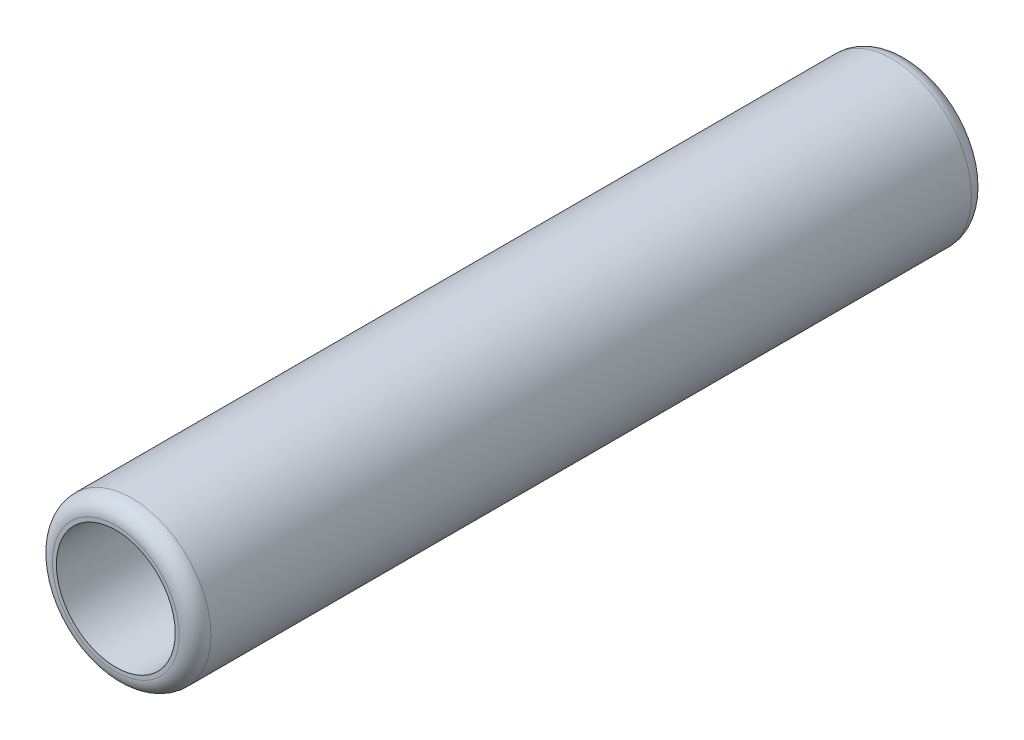
ISO-10303-21;
HEADER;
FILE_DESCRIPTION(('STEP AP214'),'2;1');
FILE_NAME('part.step','',(''),(''),'','','');
FILE_SCHEMA(('AUTOMOTIVE_DESIGN { 1 0 10303 214 1 1 1 1 }'));
ENDSEC;
DATA;
#1=APPLICATION_CONTEXT('core data for automotive mechanical design processes');
#2=APPLICATION_PROTOCOL_DEFINITION('international standard','automotive_design',2000,#1);
#3=PRODUCT_CONTEXT('',#1,'mechanical');
#4=PRODUCT('Part','Part','',(#3));
#5=PRODUCT_RELATED_PRODUCT_CATEGORY('part','',(#4));
#6=PRODUCT_DEFINITION_FORMATION('','',#4);
#7=PRODUCT_DEFINITION_CONTEXT('part definition',#1,'design');
#8=PRODUCT_DEFINITION('design','',#6,#7);
#9=PRODUCT_DEFINITION_SHAPE('','',#8);
#10=(LENGTH_UNIT() NAMED_UNIT(*) SI_UNIT(.MILLI.,.METRE.));
#11=(NAMED_UNIT(*) PLANE_ANGLE_UNIT() SI_UNIT($,.RADIAN.));
#12=(NAMED_UNIT(*) SI_UNIT($,.STERADIAN.) SOLID_ANGLE_UNIT());
#13=UNCERTAINTY_MEASURE_WITH_UNIT(LENGTH_MEASURE(1.E-05),#10,'distance_accuracy_value','');
#14=(GEOMETRIC_REPRESENTATION_CONTEXT(3) GLOBAL_UNCERTAINTY_ASSIGNED_CONTEXT((#13)) GLOBAL_UNIT_ASSIGNED_CONTEXT((#10,
#11,#12)) REPRESENTATION_CONTEXT('',''));
#15=CARTESIAN_POINT('',(0.,0.,0.));
#16=DIRECTION('',(0.,0.,1.));
#17=DIRECTION('',(1.,0.,0.));
#18=AXIS2_PLACEMENT_3D('',#15,#16,#17);
#19=CARTESIAN_POINT('',(0.,0.,100.));
#20=DIRECTION('',(0.,0.,1.));
#21=DIRECTION('',(1.,0.,0.));
#22=AXIS2_PLACEMENT_3D('',#19,#20,#21);
#23=PLANE('',#22);
#24=CARTESIAN_POINT('',(0.,0.,100.));
#25=DIRECTION('',(0.,0.,1.));
#26=DIRECTION('',(1.,0.,0.));
#27=AXIS2_PLACEMENT_3D('',#24,#25,#26);
#28=CIRCLE('',#27,8.);
#29=CARTESIAN_POINT('',(8.,0.,100.));
#30=VERTEX_POINT('',#29);
#31=EDGE_CURVE('E10',#30,#30,#28,.T.);
#32=ORIENTED_EDGE('',*,*,#31,.T.);
#33=EDGE_LOOP('',(#32));
#34=FACE_BOUND('',#33,.T.);
#35=CARTESIAN_POINT('',(0.,0.,100.));
#36=DIRECTION('',(0.,0.,1.));
#37=DIRECTION('',(1.,0.,0.));
#38=AXIS2_PLACEMENT_3D('',#35,#36,#37);
#39=CIRCLE('',#38,7.5);
#40=CARTESIAN_POINT('',(7.5,0.,100.));
#41=VERTEX_POINT('',#40);
#42=EDGE_CURVE('E63',#41,#41,#39,.T.);
#43=ORIENTED_EDGE('',*,*,#42,.F.);
#44=EDGE_LOOP('',(#43));
#45=FACE_BOUND('',#44,.T.);
#46=ADVANCED_FACE('F39',(#34,#45),#23,.T.);
#47=CARTESIAN_POINT('',(0.,0.,0.));
#48=DIRECTION('',(0.,0.,1.));
#49=DIRECTION('',(1.,0.,0.));
#50=AXIS2_PLACEMENT_3D('',#47,#48,#49);
#51=PLANE('',#50);
#52=CARTESIAN_POINT('',(0.,0.,0.));
#53=DIRECTION('',(0.,0.,1.));
#54=DIRECTION('',(1.,0.,0.));
#55=AXIS2_PLACEMENT_3D('',#52,#53,#54);
#56=CIRCLE('',#55,8.);
#57=CARTESIAN_POINT('',(8.,0.,0.));
#58=VERTEX_POINT('',#57);
#59=EDGE_CURVE('E47',#58,#58,#56,.F.);
#60=ORIENTED_EDGE('',*,*,#59,.T.);
#61=EDGE_LOOP('',(#60));
#62=FACE_BOUND('',#61,.T.);
#63=CARTESIAN_POINT('',(0.,0.,0.));
#64=DIRECTION('',(0.,0.,1.));
#65=DIRECTION('',(1.,0.,0.));
#66=AXIS2_PLACEMENT_3D('',#63,#64,#65);
#67=CIRCLE('',#66,7.5);
#68=CARTESIAN_POINT('',(7.5,0.,0.));
#69=VERTEX_POINT('',#68);
#70=EDGE_CURVE('E64',#69,#69,#67,.T.);
#71=ORIENTED_EDGE('',*,*,#70,.T.);
#72=EDGE_LOOP('',(#71));
#73=FACE_BOUND('',#72,.T.);
#74=ADVANCED_FACE('F76',(#62,#73),#51,.F.);
#75=CARTESIAN_POINT('',(0.,0.,100.));
#76=DIRECTION('',(0.,0.,-1.));
#77=DIRECTION('',(-1.,0.,0.));
#78=AXIS2_PLACEMENT_3D('',#75,#76,#77);
#79=CYLINDRICAL_SURFACE('',#78,10.);
#80=CARTESIAN_POINT('',(0.,0.,2.));
#81=DIRECTION('',(0.,0.,1.));
#82=DIRECTION('',(1.,0.,0.));
#83=AXIS2_PLACEMENT_3D('',#80,#81,#82);
#84=CIRCLE('',#83,10.);
#85=CARTESIAN_POINT('',(10.,0.,2.));
#86=VERTEX_POINT('',#85);
#87=EDGE_CURVE('E52',#86,#86,#84,.T.);
#88=ORIENTED_EDGE('',*,*,#87,.T.);
#89=EDGE_LOOP('',(#88));
#90=FACE_BOUND('',#89,.T.);
#91=CARTESIAN_POINT('',(0.,0.,98.));
#92=DIRECTION('',(0.,0.,1.));
#93=DIRECTION('',(1.,0.,0.));
#94=AXIS2_PLACEMENT_3D('',#91,#92,#93);
#95=CIRCLE('',#94,10.);
#96=CARTESIAN_POINT('',(10.,0.,98.));
#97=VERTEX_POINT('',#96);
#98=EDGE_CURVE('E57',#97,#97,#95,.F.);
#99=ORIENTED_EDGE('',*,*,#98,.T.);
#100=EDGE_LOOP('',(#99));
#101=FACE_BOUND('',#100,.T.);
#102=ADVANCED_FACE('F81',(#90,#101),#79,.T.);
#103=CARTESIAN_POINT('',(0.,0.,100.));
#104=DIRECTION('',(0.,0.,-1.));
#105=DIRECTION('',(-1.,0.,0.));
#106=AXIS2_PLACEMENT_3D('',#103,#104,#105);
#107=CYLINDRICAL_SURFACE('',#106,7.5);
#108=ORIENTED_EDGE('',*,*,#42,.T.);
#109=EDGE_LOOP('',(#108));
#110=FACE_BOUND('',#109,.T.);
#111=ORIENTED_EDGE('',*,*,#70,.F.);
#112=EDGE_LOOP('',(#111));
#113=FACE_BOUND('',#112,.T.);
#114=ADVANCED_FACE('F72',(#110,#113),#107,.F.);
#115=CARTESIAN_POINT('',(0.,0.,2.));
#116=DIRECTION('',(0.,0.,1.));
#117=DIRECTION('',(1.,0.,0.));
#118=AXIS2_PLACEMENT_3D('',#115,#116,#117);
#119=TOROIDAL_SURFACE('',#118,8.,2.);
#120=ORIENTED_EDGE('',*,*,#59,.F.);
#121=EDGE_LOOP('',(#120));
#122=FACE_BOUND('',#121,.T.);
#123=ORIENTED_EDGE('',*,*,#87,.F.);
#124=EDGE_LOOP('',(#123));
#125=FACE_BOUND('',#124,.T.);
#126=ADVANCED_FACE('F87',(#122,#125),#119,.T.);
#127=CARTESIAN_POINT('',(0.,0.,98.));
#128=DIRECTION('',(0.,0.,1.));
#129=DIRECTION('',(1.,0.,0.));
#130=AXIS2_PLACEMENT_3D('',#127,#128,#129);
#131=TOROIDAL_SURFACE('',#130,8.,2.);
#132=ORIENTED_EDGE('',*,*,#98,.F.);
#133=EDGE_LOOP('',(#132));
#134=FACE_BOUND('',#133,.T.);
#135=ORIENTED_EDGE('',*,*,#31,.F.);
#136=EDGE_LOOP('',(#135));
#137=FACE_BOUND('',#136,.T.);
#138=ADVANCED_FACE('F41',(#134,#137),#131,.T.);
#139=CLOSED_SHELL('',(#46,#74,#102,#114,#126,#138));
#140=MANIFOLD_SOLID_BREP('B2',#139);
#141=ADVANCED_BREP_SHAPE_REPRESENTATION('',(#18,#140),#14);
#142=SHAPE_DEFINITION_REPRESENTATION(#9,#141);
ENDSEC;
END-ISO-10303-21;
